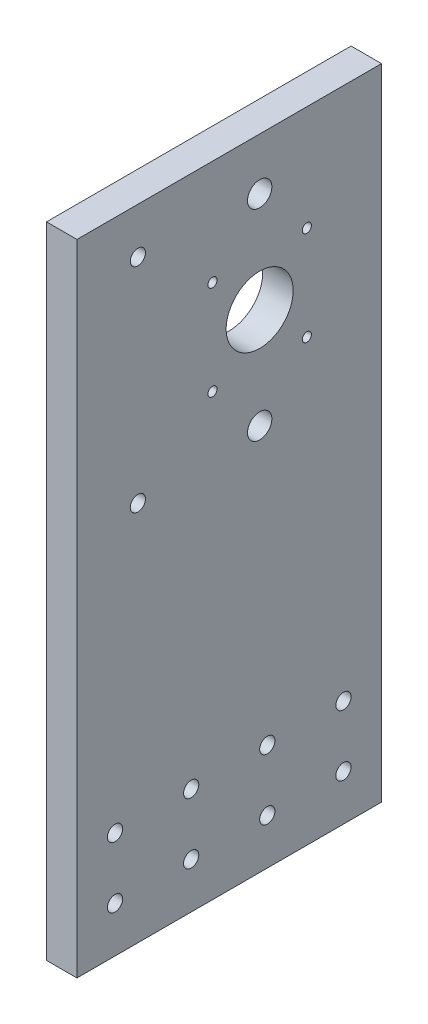
ISO-10303-21;
HEADER;
FILE_DESCRIPTION(('STEP AP214'),'2;1');
FILE_NAME('part.step','',(''),(''),'','','');
FILE_SCHEMA(('AUTOMOTIVE_DESIGN { 1 0 10303 214 1 1 1 1 }'));
ENDSEC;
DATA;
#1=APPLICATION_CONTEXT('core data for automotive mechanical design processes');
#2=APPLICATION_PROTOCOL_DEFINITION('international standard','automotive_design',2000,#1);
#3=PRODUCT_CONTEXT('',#1,'mechanical');
#4=PRODUCT('Part','Part','',(#3));
#5=PRODUCT_RELATED_PRODUCT_CATEGORY('part','',(#4));
#6=PRODUCT_DEFINITION_FORMATION('','',#4);
#7=PRODUCT_DEFINITION_CONTEXT('part definition',#1,'design');
#8=PRODUCT_DEFINITION('design','',#6,#7);
#9=PRODUCT_DEFINITION_SHAPE('','',#8);
#10=(LENGTH_UNIT() NAMED_UNIT(*) SI_UNIT(.MILLI.,.METRE.));
#11=(NAMED_UNIT(*) PLANE_ANGLE_UNIT() SI_UNIT($,.RADIAN.));
#12=(NAMED_UNIT(*) SI_UNIT($,.STERADIAN.) SOLID_ANGLE_UNIT());
#13=UNCERTAINTY_MEASURE_WITH_UNIT(LENGTH_MEASURE(1.E-05),#10,'distance_accuracy_value','');
#14=(GEOMETRIC_REPRESENTATION_CONTEXT(3) GLOBAL_UNCERTAINTY_ASSIGNED_CONTEXT((#13)) GLOBAL_UNIT_ASSIGNED_CONTEXT((#10,
#11,#12)) REPRESENTATION_CONTEXT('',''));
#15=CARTESIAN_POINT('',(0.,0.,0.));
#16=DIRECTION('',(0.,0.,1.));
#17=DIRECTION('',(1.,0.,0.));
#18=AXIS2_PLACEMENT_3D('',#15,#16,#17);
#19=CARTESIAN_POINT('',(10.,0.,0.));
#20=DIRECTION('',(1.,0.,0.));
#21=DIRECTION('',(0.,0.,-1.));
#22=AXIS2_PLACEMENT_3D('',#19,#20,#21);
#23=PLANE('',#22);
#24=CARTESIAN_POINT('',(10.,39.4999999999999,-15.5));
#25=DIRECTION('',(1.,0.,0.));
#26=DIRECTION('',(0.,0.,-1.));
#27=AXIS2_PLACEMENT_3D('',#24,#25,#26);
#28=CIRCLE('',#27,1.5);
#29=CARTESIAN_POINT('',(10.,39.4999999999999,-17.));
#30=VERTEX_POINT('',#29);
#31=EDGE_CURVE('E191',#30,#30,#28,.T.);
#32=ORIENTED_EDGE('',*,*,#31,.F.);
#33=EDGE_LOOP('',(#32));
#34=FACE_BOUND('',#33,.T.);
#35=CARTESIAN_POINT('',(10.,39.5,15.5));
#36=DIRECTION('',(1.,0.,0.));
#37=DIRECTION('',(0.,0.,1.));
#38=AXIS2_PLACEMENT_3D('',#35,#36,#37);
#39=CIRCLE('',#38,1.5);
#40=CARTESIAN_POINT('',(10.,39.5,17.));
#41=VERTEX_POINT('',#40);
#42=EDGE_CURVE('E197',#41,#41,#39,.T.);
#43=ORIENTED_EDGE('',*,*,#42,.F.);
#44=EDGE_LOOP('',(#43));
#45=FACE_BOUND('',#44,.T.);
#46=CARTESIAN_POINT('',(10.,70.5,-15.5));
#47=DIRECTION('',(1.,0.,0.));
#48=DIRECTION('',(0.,0.,1.));
#49=AXIS2_PLACEMENT_3D('',#46,#47,#48);
#50=CIRCLE('',#49,1.5);
#51=CARTESIAN_POINT('',(10.,70.5,-14.));
#52=VERTEX_POINT('',#51);
#53=EDGE_CURVE('E203',#52,#52,#50,.T.);
#54=ORIENTED_EDGE('',*,*,#53,.F.);
#55=EDGE_LOOP('',(#54));
#56=FACE_BOUND('',#55,.T.);
#57=CARTESIAN_POINT('',(10.,70.5,15.5));
#58=DIRECTION('',(1.,0.,0.));
#59=DIRECTION('',(0.,0.,-1.));
#60=AXIS2_PLACEMENT_3D('',#57,#58,#59);
#61=CIRCLE('',#60,1.5);
#62=CARTESIAN_POINT('',(10.,70.5,14.));
#63=VERTEX_POINT('',#62);
#64=EDGE_CURVE('E209',#63,#63,#61,.T.);
#65=ORIENTED_EDGE('',*,*,#64,.F.);
#66=EDGE_LOOP('',(#65));
#67=FACE_BOUND('',#66,.T.);
#68=CARTESIAN_POINT('',(10.,55.,0.));
#69=DIRECTION('',(1.,0.,0.));
#70=DIRECTION('',(0.,0.,-1.));
#71=AXIS2_PLACEMENT_3D('',#68,#69,#70);
#72=CIRCLE('',#71,11.);
#73=CARTESIAN_POINT('',(10.,55.,-11.));
#74=VERTEX_POINT('',#73);
#75=EDGE_CURVE('E185',#74,#74,#72,.T.);
#76=ORIENTED_EDGE('',*,*,#75,.F.);
#77=EDGE_LOOP('',(#76));
#78=FACE_BOUND('',#77,.T.);
#79=CARTESIAN_POINT('',(10.,90.,40.));
#80=DIRECTION('',(1.,0.,0.));
#81=DIRECTION('',(0.,0.,-1.));
#82=AXIS2_PLACEMENT_3D('',#79,#80,#81);
#83=CIRCLE('',#82,2.5);
#84=CARTESIAN_POINT('',(10.,90.,37.5));
#85=VERTEX_POINT('',#84);
#86=EDGE_CURVE('E180',#85,#85,#83,.T.);
#87=ORIENTED_EDGE('',*,*,#86,.F.);
#88=EDGE_LOOP('',(#87));
#89=FACE_BOUND('',#88,.T.);
#90=CARTESIAN_POINT('',(10.,19.9999999999999,40.));
#91=DIRECTION('',(1.,0.,0.));
#92=DIRECTION('',(0.,0.,1.));
#93=AXIS2_PLACEMENT_3D('',#90,#91,#92);
#94=CIRCLE('',#93,2.5);
#95=CARTESIAN_POINT('',(10.,19.9999999999999,42.5));
#96=VERTEX_POINT('',#95);
#97=EDGE_CURVE('E173',#96,#96,#94,.T.);
#98=ORIENTED_EDGE('',*,*,#97,.F.);
#99=EDGE_LOOP('',(#98));
#100=FACE_BOUND('',#99,.T.);
#101=CARTESIAN_POINT('',(10.,-70.,47.5));
#102=DIRECTION('',(1.,0.,0.));
#103=DIRECTION('',(0.,0.,1.));
#104=AXIS2_PLACEMENT_3D('',#101,#102,#103);
#105=CIRCLE('',#104,2.5);
#106=CARTESIAN_POINT('',(10.,-70.,50.));
#107=VERTEX_POINT('',#106);
#108=EDGE_CURVE('E150',#107,#107,#105,.T.);
#109=ORIENTED_EDGE('',*,*,#108,.F.);
#110=EDGE_LOOP('',(#109));
#111=FACE_BOUND('',#110,.T.);
#112=CARTESIAN_POINT('',(10.,-90.,47.5));
#113=DIRECTION('',(1.,0.,0.));
#114=DIRECTION('',(0.,0.,-1.));
#115=AXIS2_PLACEMENT_3D('',#112,#113,#114);
#116=CIRCLE('',#115,2.5);
#117=CARTESIAN_POINT('',(10.,-90.,45.));
#118=VERTEX_POINT('',#117);
#119=EDGE_CURVE('E144',#118,#118,#116,.T.);
#120=ORIENTED_EDGE('',*,*,#119,.F.);
#121=EDGE_LOOP('',(#120));
#122=FACE_BOUND('',#121,.T.);
#123=CARTESIAN_POINT('',(10.,-90.,22.5));
#124=DIRECTION('',(1.,0.,0.));
#125=DIRECTION('',(0.,0.,1.));
#126=AXIS2_PLACEMENT_3D('',#123,#124,#125);
#127=CIRCLE('',#126,2.5);
#128=CARTESIAN_POINT('',(10.,-90.,25.));
#129=VERTEX_POINT('',#128);
#130=EDGE_CURVE('E138',#129,#129,#127,.T.);
#131=ORIENTED_EDGE('',*,*,#130,.F.);
#132=EDGE_LOOP('',(#131));
#133=FACE_BOUND('',#132,.T.);
#134=CARTESIAN_POINT('',(10.,-90.,-2.5));
#135=DIRECTION('',(1.,0.,0.));
#136=DIRECTION('',(0.,0.,-1.));
#137=AXIS2_PLACEMENT_3D('',#134,#135,#136);
#138=CIRCLE('',#137,2.5);
#139=CARTESIAN_POINT('',(10.,-90.,-4.99999999999999));
#140=VERTEX_POINT('',#139);
#141=EDGE_CURVE('E131',#140,#140,#138,.T.);
#142=ORIENTED_EDGE('',*,*,#141,.F.);
#143=EDGE_LOOP('',(#142));
#144=FACE_BOUND('',#143,.T.);
#145=CARTESIAN_POINT('',(10.,-90.,-27.5));
#146=DIRECTION('',(1.,0.,0.));
#147=DIRECTION('',(0.,0.,1.));
#148=AXIS2_PLACEMENT_3D('',#145,#146,#147);
#149=CIRCLE('',#148,2.5);
#150=CARTESIAN_POINT('',(10.,-90.,-25.));
#151=VERTEX_POINT('',#150);
#152=EDGE_CURVE('E168',#151,#151,#149,.T.);
#153=ORIENTED_EDGE('',*,*,#152,.F.);
#154=EDGE_LOOP('',(#153));
#155=FACE_BOUND('',#154,.T.);
#156=CARTESIAN_POINT('',(10.,-70.,-27.5));
#157=DIRECTION('',(1.,0.,0.));
#158=DIRECTION('',(0.,0.,-1.));
#159=AXIS2_PLACEMENT_3D('',#156,#157,#158);
#160=CIRCLE('',#159,2.5);
#161=CARTESIAN_POINT('',(10.,-70.,-30.));
#162=VERTEX_POINT('',#161);
#163=EDGE_CURVE('E162',#162,#162,#160,.T.);
#164=ORIENTED_EDGE('',*,*,#163,.F.);
#165=EDGE_LOOP('',(#164));
#166=FACE_BOUND('',#165,.T.);
#167=CARTESIAN_POINT('',(10.,-70.,-2.5));
#168=DIRECTION('',(1.,0.,0.));
#169=DIRECTION('',(0.,0.,1.));
#170=AXIS2_PLACEMENT_3D('',#167,#168,#169);
#171=CIRCLE('',#170,2.5);
#172=CARTESIAN_POINT('',(10.,-70.,0.));
#173=VERTEX_POINT('',#172);
#174=EDGE_CURVE('E155',#173,#173,#171,.T.);
#175=ORIENTED_EDGE('',*,*,#174,.F.);
#176=EDGE_LOOP('',(#175));
#177=FACE_BOUND('',#176,.T.);
#178=CARTESIAN_POINT('',(10.,-70.,22.5));
#179=DIRECTION('',(1.,0.,0.));
#180=DIRECTION('',(0.,0.,-1.));
#181=AXIS2_PLACEMENT_3D('',#178,#179,#180);
#182=CIRCLE('',#181,2.5);
#183=CARTESIAN_POINT('',(10.,-70.,20.));
#184=VERTEX_POINT('',#183);
#185=EDGE_CURVE('E125',#184,#184,#182,.T.);
#186=ORIENTED_EDGE('',*,*,#185,.F.);
#187=EDGE_LOOP('',(#186));
#188=FACE_BOUND('',#187,.T.);
#189=CARTESIAN_POINT('',(10.,88.,0.));
#190=DIRECTION('',(1.,0.,0.));
#191=DIRECTION('',(0.,0.,-1.));
#192=AXIS2_PLACEMENT_3D('',#189,#190,#191);
#193=CIRCLE('',#192,4.00000000000001);
#194=CARTESIAN_POINT('',(10.,88.,-4.00000000000001));
#195=VERTEX_POINT('',#194);
#196=EDGE_CURVE('E101',#195,#195,#193,.T.);
#197=ORIENTED_EDGE('',*,*,#196,.F.);
#198=EDGE_LOOP('',(#197));
#199=FACE_BOUND('',#198,.T.);
#200=DIRECTION('',(0.,-1.,0.));
#201=VECTOR('',#200,1.);
#202=CARTESIAN_POINT('',(10.,-105.,60.));
#203=LINE('',#202,#201);
#204=CARTESIAN_POINT('',(10.,105.,60.));
#205=VERTEX_POINT('',#204);
#206=CARTESIAN_POINT('',(10.,-105.,60.));
#207=VERTEX_POINT('',#206);
#208=EDGE_CURVE('E86',#205,#207,#203,.T.);
#209=ORIENTED_EDGE('',*,*,#208,.T.);
#210=DIRECTION('',(0.,0.,-1.));
#211=VECTOR('',#210,1.);
#212=CARTESIAN_POINT('',(10.,-105.,-40.));
#213=LINE('',#212,#211);
#214=CARTESIAN_POINT('',(10.,-105.,-40.));
#215=VERTEX_POINT('',#214);
#216=EDGE_CURVE('E81',#207,#215,#213,.T.);
#217=ORIENTED_EDGE('',*,*,#216,.T.);
#218=DIRECTION('',(0.,1.,0.));
#219=VECTOR('',#218,1.);
#220=CARTESIAN_POINT('',(10.,-105.,-40.));
#221=LINE('',#220,#219);
#222=CARTESIAN_POINT('',(10.,105.,-40.));
#223=VERTEX_POINT('',#222);
#224=EDGE_CURVE('E84',#215,#223,#221,.T.);
#225=ORIENTED_EDGE('',*,*,#224,.T.);
#226=DIRECTION('',(0.,0.,1.));
#227=VECTOR('',#226,1.);
#228=CARTESIAN_POINT('',(10.,105.,-40.));
#229=LINE('',#228,#227);
#230=EDGE_CURVE('E51',#223,#205,#229,.T.);
#231=ORIENTED_EDGE('',*,*,#230,.T.);
#232=EDGE_LOOP('',(#209,#217,#225,#231));
#233=FACE_BOUND('',#232,.T.);
#234=CARTESIAN_POINT('',(10.,22.,0.));
#235=DIRECTION('',(1.,0.,0.));
#236=DIRECTION('',(0.,0.,1.));
#237=AXIS2_PLACEMENT_3D('',#234,#235,#236);
#238=CIRCLE('',#237,4.);
#239=CARTESIAN_POINT('',(10.,22.,4.));
#240=VERTEX_POINT('',#239);
#241=EDGE_CURVE('E116',#240,#240,#238,.T.);
#242=ORIENTED_EDGE('',*,*,#241,.F.);
#243=EDGE_LOOP('',(#242));
#244=FACE_BOUND('',#243,.T.);
#245=ADVANCED_FACE('F34',(#34,#45,#56,#67,#78,#89,#100,#111,#122,#133,#144,#155,#166,#177,#188,
#199,#233,#244),#23,.T.);
#246=CARTESIAN_POINT('',(0.,0.,0.));
#247=DIRECTION('',(1.,0.,0.));
#248=DIRECTION('',(0.,0.,-1.));
#249=AXIS2_PLACEMENT_3D('',#246,#247,#248);
#250=PLANE('',#249);
#251=CARTESIAN_POINT('',(0.,39.4999999999999,-15.5));
#252=DIRECTION('',(1.,0.,0.));
#253=DIRECTION('',(0.,0.,-1.));
#254=AXIS2_PLACEMENT_3D('',#251,#252,#253);
#255=CIRCLE('',#254,1.5);
#256=CARTESIAN_POINT('',(0.,39.4999999999999,-17.));
#257=VERTEX_POINT('',#256);
#258=EDGE_CURVE('E194',#257,#257,#255,.T.);
#259=ORIENTED_EDGE('',*,*,#258,.T.);
#260=EDGE_LOOP('',(#259));
#261=FACE_BOUND('',#260,.T.);
#262=CARTESIAN_POINT('',(0.,39.5,15.5));
#263=DIRECTION('',(1.,0.,0.));
#264=DIRECTION('',(0.,0.,1.));
#265=AXIS2_PLACEMENT_3D('',#262,#263,#264);
#266=CIRCLE('',#265,1.5);
#267=CARTESIAN_POINT('',(0.,39.5,17.));
#268=VERTEX_POINT('',#267);
#269=EDGE_CURVE('E200',#268,#268,#266,.T.);
#270=ORIENTED_EDGE('',*,*,#269,.T.);
#271=EDGE_LOOP('',(#270));
#272=FACE_BOUND('',#271,.T.);
#273=CARTESIAN_POINT('',(0.,70.5,-15.5));
#274=DIRECTION('',(1.,0.,0.));
#275=DIRECTION('',(0.,0.,1.));
#276=AXIS2_PLACEMENT_3D('',#273,#274,#275);
#277=CIRCLE('',#276,1.5);
#278=CARTESIAN_POINT('',(0.,70.5,-14.));
#279=VERTEX_POINT('',#278);
#280=EDGE_CURVE('E206',#279,#279,#277,.T.);
#281=ORIENTED_EDGE('',*,*,#280,.T.);
#282=EDGE_LOOP('',(#281));
#283=FACE_BOUND('',#282,.T.);
#284=CARTESIAN_POINT('',(0.,70.5,15.5));
#285=DIRECTION('',(1.,0.,0.));
#286=DIRECTION('',(0.,0.,-1.));
#287=AXIS2_PLACEMENT_3D('',#284,#285,#286);
#288=CIRCLE('',#287,1.5);
#289=CARTESIAN_POINT('',(0.,70.5,14.));
#290=VERTEX_POINT('',#289);
#291=EDGE_CURVE('E188',#290,#290,#288,.T.);
#292=ORIENTED_EDGE('',*,*,#291,.T.);
#293=EDGE_LOOP('',(#292));
#294=FACE_BOUND('',#293,.T.);
#295=CARTESIAN_POINT('',(0.,55.,0.));
#296=DIRECTION('',(1.,0.,0.));
#297=DIRECTION('',(0.,0.,-1.));
#298=AXIS2_PLACEMENT_3D('',#295,#296,#297);
#299=CIRCLE('',#298,11.);
#300=CARTESIAN_POINT('',(0.,55.,-11.));
#301=VERTEX_POINT('',#300);
#302=EDGE_CURVE('E177',#301,#301,#299,.T.);
#303=ORIENTED_EDGE('',*,*,#302,.T.);
#304=EDGE_LOOP('',(#303));
#305=FACE_BOUND('',#304,.T.);
#306=CARTESIAN_POINT('',(0.,90.,40.));
#307=DIRECTION('',(1.,0.,0.));
#308=DIRECTION('',(0.,0.,-1.));
#309=AXIS2_PLACEMENT_3D('',#306,#307,#308);
#310=CIRCLE('',#309,2.5);
#311=CARTESIAN_POINT('',(0.,90.,37.5));
#312=VERTEX_POINT('',#311);
#313=EDGE_CURVE('E159',#312,#312,#310,.T.);
#314=ORIENTED_EDGE('',*,*,#313,.T.);
#315=EDGE_LOOP('',(#314));
#316=FACE_BOUND('',#315,.T.);
#317=CARTESIAN_POINT('',(0.,19.9999999999999,40.));
#318=DIRECTION('',(1.,0.,0.));
#319=DIRECTION('',(0.,0.,1.));
#320=AXIS2_PLACEMENT_3D('',#317,#318,#319);
#321=CIRCLE('',#320,2.5);
#322=CARTESIAN_POINT('',(0.,19.9999999999999,42.5));
#323=VERTEX_POINT('',#322);
#324=EDGE_CURVE('E176',#323,#323,#321,.T.);
#325=ORIENTED_EDGE('',*,*,#324,.T.);
#326=EDGE_LOOP('',(#325));
#327=FACE_BOUND('',#326,.T.);
#328=CARTESIAN_POINT('',(0.,-70.,47.5));
#329=DIRECTION('',(1.,0.,0.));
#330=DIRECTION('',(0.,0.,1.));
#331=AXIS2_PLACEMENT_3D('',#328,#329,#330);
#332=CIRCLE('',#331,2.5);
#333=CARTESIAN_POINT('',(0.,-70.,50.));
#334=VERTEX_POINT('',#333);
#335=EDGE_CURVE('E128',#334,#334,#332,.T.);
#336=ORIENTED_EDGE('',*,*,#335,.T.);
#337=EDGE_LOOP('',(#336));
#338=FACE_BOUND('',#337,.T.);
#339=CARTESIAN_POINT('',(0.,-90.,47.5));
#340=DIRECTION('',(1.,0.,0.));
#341=DIRECTION('',(0.,0.,-1.));
#342=AXIS2_PLACEMENT_3D('',#339,#340,#341);
#343=CIRCLE('',#342,2.5);
#344=CARTESIAN_POINT('',(0.,-90.,45.));
#345=VERTEX_POINT('',#344);
#346=EDGE_CURVE('E147',#345,#345,#343,.T.);
#347=ORIENTED_EDGE('',*,*,#346,.T.);
#348=EDGE_LOOP('',(#347));
#349=FACE_BOUND('',#348,.T.);
#350=CARTESIAN_POINT('',(0.,-90.,22.5));
#351=DIRECTION('',(1.,0.,0.));
#352=DIRECTION('',(0.,0.,1.));
#353=AXIS2_PLACEMENT_3D('',#350,#351,#352);
#354=CIRCLE('',#353,2.5);
#355=CARTESIAN_POINT('',(0.,-90.,25.));
#356=VERTEX_POINT('',#355);
#357=EDGE_CURVE('E141',#356,#356,#354,.T.);
#358=ORIENTED_EDGE('',*,*,#357,.T.);
#359=EDGE_LOOP('',(#358));
#360=FACE_BOUND('',#359,.T.);
#361=CARTESIAN_POINT('',(0.,-90.,-2.5));
#362=DIRECTION('',(1.,0.,0.));
#363=DIRECTION('',(0.,0.,-1.));
#364=AXIS2_PLACEMENT_3D('',#361,#362,#363);
#365=CIRCLE('',#364,2.5);
#366=CARTESIAN_POINT('',(0.,-90.,-4.99999999999999));
#367=VERTEX_POINT('',#366);
#368=EDGE_CURVE('E134',#367,#367,#365,.T.);
#369=ORIENTED_EDGE('',*,*,#368,.T.);
#370=EDGE_LOOP('',(#369));
#371=FACE_BOUND('',#370,.T.);
#372=CARTESIAN_POINT('',(0.,-90.,-27.5));
#373=DIRECTION('',(1.,0.,0.));
#374=DIRECTION('',(0.,0.,1.));
#375=AXIS2_PLACEMENT_3D('',#372,#373,#374);
#376=CIRCLE('',#375,2.5);
#377=CARTESIAN_POINT('',(0.,-90.,-25.));
#378=VERTEX_POINT('',#377);
#379=EDGE_CURVE('E135',#378,#378,#376,.T.);
#380=ORIENTED_EDGE('',*,*,#379,.T.);
#381=EDGE_LOOP('',(#380));
#382=FACE_BOUND('',#381,.T.);
#383=CARTESIAN_POINT('',(0.,-70.,-27.5));
#384=DIRECTION('',(1.,0.,0.));
#385=DIRECTION('',(0.,0.,-1.));
#386=AXIS2_PLACEMENT_3D('',#383,#384,#385);
#387=CIRCLE('',#386,2.5);
#388=CARTESIAN_POINT('',(0.,-70.,-30.));
#389=VERTEX_POINT('',#388);
#390=EDGE_CURVE('E165',#389,#389,#387,.T.);
#391=ORIENTED_EDGE('',*,*,#390,.T.);
#392=EDGE_LOOP('',(#391));
#393=FACE_BOUND('',#392,.T.);
#394=CARTESIAN_POINT('',(0.,-70.,-2.5));
#395=DIRECTION('',(1.,0.,0.));
#396=DIRECTION('',(0.,0.,1.));
#397=AXIS2_PLACEMENT_3D('',#394,#395,#396);
#398=CIRCLE('',#397,2.5);
#399=CARTESIAN_POINT('',(0.,-70.,0.));
#400=VERTEX_POINT('',#399);
#401=EDGE_CURVE('E158',#400,#400,#398,.T.);
#402=ORIENTED_EDGE('',*,*,#401,.T.);
#403=EDGE_LOOP('',(#402));
#404=FACE_BOUND('',#403,.T.);
#405=CARTESIAN_POINT('',(0.,-70.,22.5));
#406=DIRECTION('',(1.,0.,0.));
#407=DIRECTION('',(0.,0.,-1.));
#408=AXIS2_PLACEMENT_3D('',#405,#406,#407);
#409=CIRCLE('',#408,2.5);
#410=CARTESIAN_POINT('',(0.,-70.,20.));
#411=VERTEX_POINT('',#410);
#412=EDGE_CURVE('E122',#411,#411,#409,.T.);
#413=ORIENTED_EDGE('',*,*,#412,.T.);
#414=EDGE_LOOP('',(#413));
#415=FACE_BOUND('',#414,.T.);
#416=DIRECTION('',(0.,-1.,0.));
#417=VECTOR('',#416,1.);
#418=CARTESIAN_POINT('',(0.,-105.,60.));
#419=LINE('',#418,#417);
#420=CARTESIAN_POINT('',(0.,105.,60.));
#421=VERTEX_POINT('',#420);
#422=CARTESIAN_POINT('',(0.,-105.,60.));
#423=VERTEX_POINT('',#422);
#424=EDGE_CURVE('E98',#421,#423,#419,.T.);
#425=ORIENTED_EDGE('',*,*,#424,.F.);
#426=DIRECTION('',(0.,0.,1.));
#427=VECTOR('',#426,1.);
#428=CARTESIAN_POINT('',(0.,105.,-40.));
#429=LINE('',#428,#427);
#430=CARTESIAN_POINT('',(0.,105.,-40.));
#431=VERTEX_POINT('',#430);
#432=EDGE_CURVE('E74',#431,#421,#429,.T.);
#433=ORIENTED_EDGE('',*,*,#432,.F.);
#434=DIRECTION('',(0.,1.,0.));
#435=VECTOR('',#434,1.);
#436=CARTESIAN_POINT('',(0.,-105.,-40.));
#437=LINE('',#436,#435);
#438=CARTESIAN_POINT('',(0.,-105.,-40.));
#439=VERTEX_POINT('',#438);
#440=EDGE_CURVE('E68',#439,#431,#437,.T.);
#441=ORIENTED_EDGE('',*,*,#440,.F.);
#442=DIRECTION('',(0.,0.,-1.));
#443=VECTOR('',#442,1.);
#444=CARTESIAN_POINT('',(0.,-105.,-40.));
#445=LINE('',#444,#443);
#446=EDGE_CURVE('E90',#423,#439,#445,.T.);
#447=ORIENTED_EDGE('',*,*,#446,.F.);
#448=EDGE_LOOP('',(#425,#433,#441,#447));
#449=FACE_BOUND('',#448,.T.);
#450=CARTESIAN_POINT('',(0.,88.,0.));
#451=DIRECTION('',(1.,0.,0.));
#452=DIRECTION('',(0.,0.,-1.));
#453=AXIS2_PLACEMENT_3D('',#450,#451,#452);
#454=CIRCLE('',#453,4.00000000000001);
#455=CARTESIAN_POINT('',(0.,88.,-4.00000000000001));
#456=VERTEX_POINT('',#455);
#457=EDGE_CURVE('E113',#456,#456,#454,.T.);
#458=ORIENTED_EDGE('',*,*,#457,.T.);
#459=EDGE_LOOP('',(#458));
#460=FACE_BOUND('',#459,.T.);
#461=CARTESIAN_POINT('',(0.,22.,0.));
#462=DIRECTION('',(1.,0.,0.));
#463=DIRECTION('',(0.,0.,1.));
#464=AXIS2_PLACEMENT_3D('',#461,#462,#463);
#465=CIRCLE('',#464,4.);
#466=CARTESIAN_POINT('',(0.,22.,4.));
#467=VERTEX_POINT('',#466);
#468=EDGE_CURVE('E119',#467,#467,#465,.T.);
#469=ORIENTED_EDGE('',*,*,#468,.T.);
#470=EDGE_LOOP('',(#469));
#471=FACE_BOUND('',#470,.T.);
#472=ADVANCED_FACE('F109',(#261,#272,#283,#294,#305,#316,#327,#338,#349,#360,#371,#382,#393,
#404,#415,#449,#460,#471),#250,.F.);
#473=CARTESIAN_POINT('',(10.,-105.,60.));
#474=DIRECTION('',(0.,0.,-1.));
#475=DIRECTION('',(-1.,0.,0.));
#476=AXIS2_PLACEMENT_3D('',#473,#474,#475);
#477=PLANE('',#476);
#478=ORIENTED_EDGE('',*,*,#424,.T.);
#479=DIRECTION('',(-1.,0.,0.));
#480=VECTOR('',#479,1.);
#481=CARTESIAN_POINT('',(10.,-105.,60.));
#482=LINE('',#481,#480);
#483=EDGE_CURVE('E11',#207,#423,#482,.T.);
#484=ORIENTED_EDGE('',*,*,#483,.F.);
#485=ORIENTED_EDGE('',*,*,#208,.F.);
#486=DIRECTION('',(-1.,0.,0.));
#487=VECTOR('',#486,1.);
#488=CARTESIAN_POINT('',(10.,105.,60.));
#489=LINE('',#488,#487);
#490=EDGE_CURVE('E94',#205,#421,#489,.T.);
#491=ORIENTED_EDGE('',*,*,#490,.T.);
#492=EDGE_LOOP('',(#478,#484,#485,#491));
#493=FACE_BOUND('',#492,.T.);
#494=ADVANCED_FACE('F36',(#493),#477,.F.);
#495=CARTESIAN_POINT('',(10.,-105.,-40.));
#496=DIRECTION('',(0.,1.,0.));
#497=DIRECTION('',(0.,0.,1.));
#498=AXIS2_PLACEMENT_3D('',#495,#496,#497);
#499=PLANE('',#498);
#500=ORIENTED_EDGE('',*,*,#446,.T.);
#501=DIRECTION('',(-1.,0.,0.));
#502=VECTOR('',#501,1.);
#503=CARTESIAN_POINT('',(10.,-105.,-40.));
#504=LINE('',#503,#502);
#505=EDGE_CURVE('E43',#215,#439,#504,.T.);
#506=ORIENTED_EDGE('',*,*,#505,.F.);
#507=ORIENTED_EDGE('',*,*,#216,.F.);
#508=ORIENTED_EDGE('',*,*,#483,.T.);
#509=EDGE_LOOP('',(#500,#506,#507,#508));
#510=FACE_BOUND('',#509,.T.);
#511=ADVANCED_FACE('F89',(#510),#499,.F.);
#512=CARTESIAN_POINT('',(10.,-105.,-40.));
#513=DIRECTION('',(0.,0.,1.));
#514=DIRECTION('',(1.,0.,0.));
#515=AXIS2_PLACEMENT_3D('',#512,#513,#514);
#516=PLANE('',#515);
#517=ORIENTED_EDGE('',*,*,#440,.T.);
#518=DIRECTION('',(-1.,0.,0.));
#519=VECTOR('',#518,1.);
#520=CARTESIAN_POINT('',(10.,105.,-40.));
#521=LINE('',#520,#519);
#522=EDGE_CURVE('E91',#223,#431,#521,.T.);
#523=ORIENTED_EDGE('',*,*,#522,.F.);
#524=ORIENTED_EDGE('',*,*,#224,.F.);
#525=ORIENTED_EDGE('',*,*,#505,.T.);
#526=EDGE_LOOP('',(#517,#523,#524,#525));
#527=FACE_BOUND('',#526,.T.);
#528=ADVANCED_FACE('F92',(#527),#516,.F.);
#529=CARTESIAN_POINT('',(10.,105.,-40.));
#530=DIRECTION('',(0.,-1.,0.));
#531=DIRECTION('',(0.,0.,-1.));
#532=AXIS2_PLACEMENT_3D('',#529,#530,#531);
#533=PLANE('',#532);
#534=ORIENTED_EDGE('',*,*,#432,.T.);
#535=ORIENTED_EDGE('',*,*,#490,.F.);
#536=ORIENTED_EDGE('',*,*,#230,.F.);
#537=ORIENTED_EDGE('',*,*,#522,.T.);
#538=EDGE_LOOP('',(#534,#535,#536,#537));
#539=FACE_BOUND('',#538,.T.);
#540=ADVANCED_FACE('F106',(#539),#533,.F.);
#541=CARTESIAN_POINT('',(10.,88.,0.));
#542=DIRECTION('',(-1.,0.,0.));
#543=DIRECTION('',(0.,0.,1.));
#544=AXIS2_PLACEMENT_3D('',#541,#542,#543);
#545=CYLINDRICAL_SURFACE('',#544,4.00000000000001);
#546=ORIENTED_EDGE('',*,*,#196,.T.);
#547=EDGE_LOOP('',(#546));
#548=FACE_BOUND('',#547,.T.);
#549=ORIENTED_EDGE('',*,*,#457,.F.);
#550=EDGE_LOOP('',(#549));
#551=FACE_BOUND('',#550,.T.);
#552=ADVANCED_FACE('F253',(#548,#551),#545,.F.);
#553=CARTESIAN_POINT('',(10.,22.,0.));
#554=DIRECTION('',(-1.,0.,0.));
#555=DIRECTION('',(0.,0.,1.));
#556=AXIS2_PLACEMENT_3D('',#553,#554,#555);
#557=CYLINDRICAL_SURFACE('',#556,4.);
#558=ORIENTED_EDGE('',*,*,#241,.T.);
#559=EDGE_LOOP('',(#558));
#560=FACE_BOUND('',#559,.T.);
#561=ORIENTED_EDGE('',*,*,#468,.F.);
#562=EDGE_LOOP('',(#561));
#563=FACE_BOUND('',#562,.T.);
#564=ADVANCED_FACE('F256',(#560,#563),#557,.F.);
#565=CARTESIAN_POINT('',(0.,-70.,22.5));
#566=DIRECTION('',(1.,0.,0.));
#567=DIRECTION('',(0.,0.,-1.));
#568=AXIS2_PLACEMENT_3D('',#565,#566,#567);
#569=CYLINDRICAL_SURFACE('',#568,2.5);
#570=ORIENTED_EDGE('',*,*,#412,.F.);
#571=EDGE_LOOP('',(#570));
#572=FACE_BOUND('',#571,.T.);
#573=ORIENTED_EDGE('',*,*,#185,.T.);
#574=EDGE_LOOP('',(#573));
#575=FACE_BOUND('',#574,.T.);
#576=ADVANCED_FACE('F266',(#572,#575),#569,.F.);
#577=CARTESIAN_POINT('',(0.,-70.,-2.5));
#578=DIRECTION('',(1.,0.,0.));
#579=DIRECTION('',(0.,0.,-1.));
#580=AXIS2_PLACEMENT_3D('',#577,#578,#579);
#581=CYLINDRICAL_SURFACE('',#580,2.5);
#582=ORIENTED_EDGE('',*,*,#401,.F.);
#583=EDGE_LOOP('',(#582));
#584=FACE_BOUND('',#583,.T.);
#585=ORIENTED_EDGE('',*,*,#174,.T.);
#586=EDGE_LOOP('',(#585));
#587=FACE_BOUND('',#586,.T.);
#588=ADVANCED_FACE('F272',(#584,#587),#581,.F.);
#589=CARTESIAN_POINT('',(0.,-70.,-27.5));
#590=DIRECTION('',(1.,0.,0.));
#591=DIRECTION('',(0.,0.,-1.));
#592=AXIS2_PLACEMENT_3D('',#589,#590,#591);
#593=CYLINDRICAL_SURFACE('',#592,2.5);
#594=ORIENTED_EDGE('',*,*,#390,.F.);
#595=EDGE_LOOP('',(#594));
#596=FACE_BOUND('',#595,.T.);
#597=ORIENTED_EDGE('',*,*,#163,.T.);
#598=EDGE_LOOP('',(#597));
#599=FACE_BOUND('',#598,.T.);
#600=ADVANCED_FACE('F366',(#596,#599),#593,.F.);
#601=CARTESIAN_POINT('',(0.,-90.,-27.5));
#602=DIRECTION('',(1.,0.,0.));
#603=DIRECTION('',(0.,0.,-1.));
#604=AXIS2_PLACEMENT_3D('',#601,#602,#603);
#605=CYLINDRICAL_SURFACE('',#604,2.5);
#606=ORIENTED_EDGE('',*,*,#379,.F.);
#607=EDGE_LOOP('',(#606));
#608=FACE_BOUND('',#607,.T.);
#609=ORIENTED_EDGE('',*,*,#152,.T.);
#610=EDGE_LOOP('',(#609));
#611=FACE_BOUND('',#610,.T.);
#612=ADVANCED_FACE('F357',(#608,#611),#605,.F.);
#613=CARTESIAN_POINT('',(0.,-90.,-2.5));
#614=DIRECTION('',(1.,0.,0.));
#615=DIRECTION('',(0.,0.,-1.));
#616=AXIS2_PLACEMENT_3D('',#613,#614,#615);
#617=CYLINDRICAL_SURFACE('',#616,2.5);
#618=ORIENTED_EDGE('',*,*,#368,.F.);
#619=EDGE_LOOP('',(#618));
#620=FACE_BOUND('',#619,.T.);
#621=ORIENTED_EDGE('',*,*,#141,.T.);
#622=EDGE_LOOP('',(#621));
#623=FACE_BOUND('',#622,.T.);
#624=ADVANCED_FACE('F347',(#620,#623),#617,.F.);
#625=CARTESIAN_POINT('',(0.,-90.,22.5));
#626=DIRECTION('',(1.,0.,0.));
#627=DIRECTION('',(0.,0.,-1.));
#628=AXIS2_PLACEMENT_3D('',#625,#626,#627);
#629=CYLINDRICAL_SURFACE('',#628,2.5);
#630=ORIENTED_EDGE('',*,*,#357,.F.);
#631=EDGE_LOOP('',(#630));
#632=FACE_BOUND('',#631,.T.);
#633=ORIENTED_EDGE('',*,*,#130,.T.);
#634=EDGE_LOOP('',(#633));
#635=FACE_BOUND('',#634,.T.);
#636=ADVANCED_FACE('F337',(#632,#635),#629,.F.);
#637=CARTESIAN_POINT('',(0.,-90.,47.5));
#638=DIRECTION('',(1.,0.,0.));
#639=DIRECTION('',(0.,0.,-1.));
#640=AXIS2_PLACEMENT_3D('',#637,#638,#639);
#641=CYLINDRICAL_SURFACE('',#640,2.5);
#642=ORIENTED_EDGE('',*,*,#346,.F.);
#643=EDGE_LOOP('',(#642));
#644=FACE_BOUND('',#643,.T.);
#645=ORIENTED_EDGE('',*,*,#119,.T.);
#646=EDGE_LOOP('',(#645));
#647=FACE_BOUND('',#646,.T.);
#648=ADVANCED_FACE('F327',(#644,#647),#641,.F.);
#649=CARTESIAN_POINT('',(0.,-70.,47.5));
#650=DIRECTION('',(1.,0.,0.));
#651=DIRECTION('',(0.,0.,-1.));
#652=AXIS2_PLACEMENT_3D('',#649,#650,#651);
#653=CYLINDRICAL_SURFACE('',#652,2.5);
#654=ORIENTED_EDGE('',*,*,#335,.F.);
#655=EDGE_LOOP('',(#654));
#656=FACE_BOUND('',#655,.T.);
#657=ORIENTED_EDGE('',*,*,#108,.T.);
#658=EDGE_LOOP('',(#657));
#659=FACE_BOUND('',#658,.T.);
#660=ADVANCED_FACE('F317',(#656,#659),#653,.F.);
#661=CARTESIAN_POINT('',(0.,19.9999999999999,40.));
#662=DIRECTION('',(1.,0.,0.));
#663=DIRECTION('',(0.,0.,-1.));
#664=AXIS2_PLACEMENT_3D('',#661,#662,#663);
#665=CYLINDRICAL_SURFACE('',#664,2.5);
#666=ORIENTED_EDGE('',*,*,#324,.F.);
#667=EDGE_LOOP('',(#666));
#668=FACE_BOUND('',#667,.T.);
#669=ORIENTED_EDGE('',*,*,#97,.T.);
#670=EDGE_LOOP('',(#669));
#671=FACE_BOUND('',#670,.T.);
#672=ADVANCED_FACE('F305',(#668,#671),#665,.F.);
#673=CARTESIAN_POINT('',(0.,90.,40.));
#674=DIRECTION('',(1.,0.,0.));
#675=DIRECTION('',(0.,0.,-1.));
#676=AXIS2_PLACEMENT_3D('',#673,#674,#675);
#677=CYLINDRICAL_SURFACE('',#676,2.5);
#678=ORIENTED_EDGE('',*,*,#313,.F.);
#679=EDGE_LOOP('',(#678));
#680=FACE_BOUND('',#679,.T.);
#681=ORIENTED_EDGE('',*,*,#86,.T.);
#682=EDGE_LOOP('',(#681));
#683=FACE_BOUND('',#682,.T.);
#684=ADVANCED_FACE('F300',(#680,#683),#677,.F.);
#685=CARTESIAN_POINT('',(0.,55.,0.));
#686=DIRECTION('',(1.,0.,0.));
#687=DIRECTION('',(0.,0.,-1.));
#688=AXIS2_PLACEMENT_3D('',#685,#686,#687);
#689=CYLINDRICAL_SURFACE('',#688,11.);
#690=ORIENTED_EDGE('',*,*,#302,.F.);
#691=EDGE_LOOP('',(#690));
#692=FACE_BOUND('',#691,.T.);
#693=ORIENTED_EDGE('',*,*,#75,.T.);
#694=EDGE_LOOP('',(#693));
#695=FACE_BOUND('',#694,.T.);
#696=ADVANCED_FACE('F221',(#692,#695),#689,.F.);
#697=CARTESIAN_POINT('',(0.,70.5,15.5));
#698=DIRECTION('',(1.,0.,0.));
#699=DIRECTION('',(0.,0.,-1.));
#700=AXIS2_PLACEMENT_3D('',#697,#698,#699);
#701=CYLINDRICAL_SURFACE('',#700,1.5);
#702=ORIENTED_EDGE('',*,*,#291,.F.);
#703=EDGE_LOOP('',(#702));
#704=FACE_BOUND('',#703,.T.);
#705=ORIENTED_EDGE('',*,*,#64,.T.);
#706=EDGE_LOOP('',(#705));
#707=FACE_BOUND('',#706,.T.);
#708=ADVANCED_FACE('F217',(#704,#707),#701,.F.);
#709=CARTESIAN_POINT('',(0.,70.5,-15.5));
#710=DIRECTION('',(1.,0.,0.));
#711=DIRECTION('',(0.,0.,-1.));
#712=AXIS2_PLACEMENT_3D('',#709,#710,#711);
#713=CYLINDRICAL_SURFACE('',#712,1.5);
#714=ORIENTED_EDGE('',*,*,#280,.F.);
#715=EDGE_LOOP('',(#714));
#716=FACE_BOUND('',#715,.T.);
#717=ORIENTED_EDGE('',*,*,#53,.T.);
#718=EDGE_LOOP('',(#717));
#719=FACE_BOUND('',#718,.T.);
#720=ADVANCED_FACE('F220',(#716,#719),#713,.F.);
#721=CARTESIAN_POINT('',(0.,39.5,15.5));
#722=DIRECTION('',(1.,0.,0.));
#723=DIRECTION('',(0.,0.,-1.));
#724=AXIS2_PLACEMENT_3D('',#721,#722,#723);
#725=CYLINDRICAL_SURFACE('',#724,1.5);
#726=ORIENTED_EDGE('',*,*,#269,.F.);
#727=EDGE_LOOP('',(#726));
#728=FACE_BOUND('',#727,.T.);
#729=ORIENTED_EDGE('',*,*,#42,.T.);
#730=EDGE_LOOP('',(#729));
#731=FACE_BOUND('',#730,.T.);
#732=ADVANCED_FACE('F433',(#728,#731),#725,.F.);
#733=CARTESIAN_POINT('',(0.,39.4999999999999,-15.5));
#734=DIRECTION('',(1.,0.,0.));
#735=DIRECTION('',(0.,0.,-1.));
#736=AXIS2_PLACEMENT_3D('',#733,#734,#735);
#737=CYLINDRICAL_SURFACE('',#736,1.5);
#738=ORIENTED_EDGE('',*,*,#258,.F.);
#739=EDGE_LOOP('',(#738));
#740=FACE_BOUND('',#739,.T.);
#741=ORIENTED_EDGE('',*,*,#31,.T.);
#742=EDGE_LOOP('',(#741));
#743=FACE_BOUND('',#742,.T.);
#744=ADVANCED_FACE('F430',(#740,#743),#737,.F.);
#745=CLOSED_SHELL('',(#245,#472,#494,#511,#528,#540,#552,#564,#576,#588,#600,#612,#624,#636,
#648,#660,#672,#684,#696,#708,#720,#732,#744));
#746=MANIFOLD_SOLID_BREP('B2',#745);
#747=ADVANCED_BREP_SHAPE_REPRESENTATION('',(#18,#746),#14);
#748=SHAPE_DEFINITION_REPRESENTATION(#9,#747);
ENDSEC;
END-ISO-10303-21;
